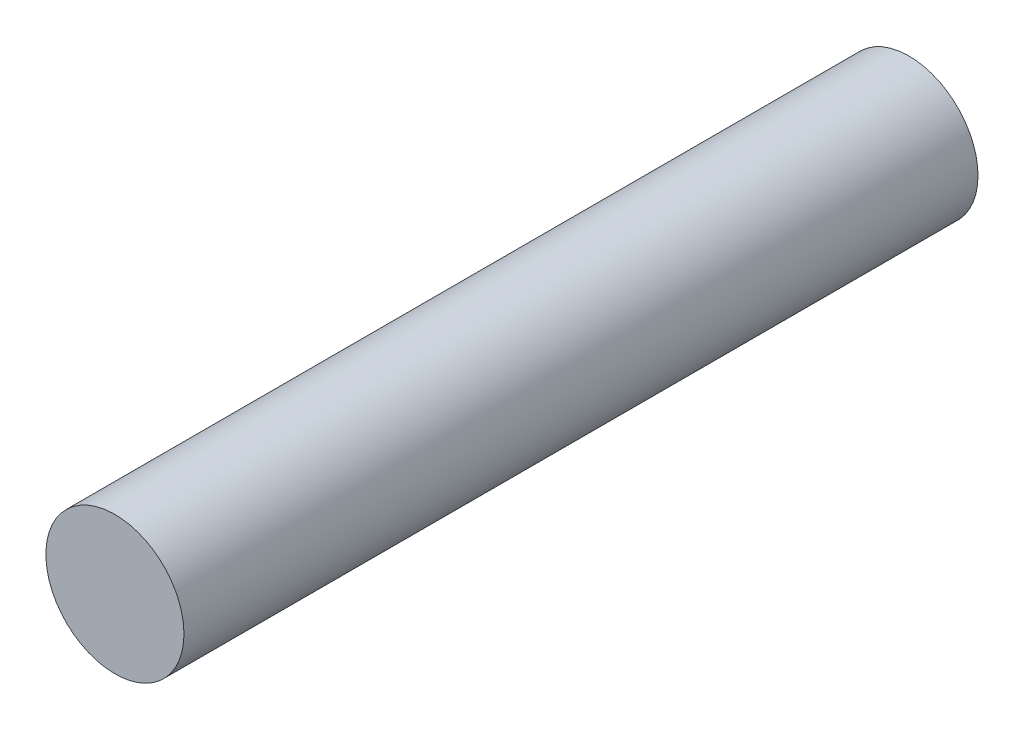
ISO-10303-21;
HEADER;
FILE_DESCRIPTION(('STEP AP214'),'2;1');
FILE_NAME('part.step','',(''),(''),'','','');
FILE_SCHEMA(('AUTOMOTIVE_DESIGN { 1 0 10303 214 1 1 1 1 }'));
ENDSEC;
DATA;
#1=APPLICATION_CONTEXT('core data for automotive mechanical design processes');
#2=APPLICATION_PROTOCOL_DEFINITION('international standard','automotive_design',2000,#1);
#3=PRODUCT_CONTEXT('',#1,'mechanical');
#4=PRODUCT('Part','Part','',(#3));
#5=PRODUCT_RELATED_PRODUCT_CATEGORY('part','',(#4));
#6=PRODUCT_DEFINITION_FORMATION('','',#4);
#7=PRODUCT_DEFINITION_CONTEXT('part definition',#1,'design');
#8=PRODUCT_DEFINITION('design','',#6,#7);
#9=PRODUCT_DEFINITION_SHAPE('','',#8);
#10=(LENGTH_UNIT() NAMED_UNIT(*) SI_UNIT(.MILLI.,.METRE.));
#11=(NAMED_UNIT(*) PLANE_ANGLE_UNIT() SI_UNIT($,.RADIAN.));
#12=(NAMED_UNIT(*) SI_UNIT($,.STERADIAN.) SOLID_ANGLE_UNIT());
#13=UNCERTAINTY_MEASURE_WITH_UNIT(LENGTH_MEASURE(1.E-05),#10,'distance_accuracy_value','');
#14=(GEOMETRIC_REPRESENTATION_CONTEXT(3) GLOBAL_UNCERTAINTY_ASSIGNED_CONTEXT((#13)) GLOBAL_UNIT_ASSIGNED_CONTEXT((#10,
#11,#12)) REPRESENTATION_CONTEXT('',''));
#15=CARTESIAN_POINT('',(0.,0.,0.));
#16=DIRECTION('',(0.,0.,1.));
#17=DIRECTION('',(1.,0.,0.));
#18=AXIS2_PLACEMENT_3D('',#15,#16,#17);
#19=CARTESIAN_POINT('',(0.,0.,10.));
#20=DIRECTION('',(0.,0.,-1.));
#21=DIRECTION('',(-1.,0.,0.));
#22=AXIS2_PLACEMENT_3D('',#19,#20,#21);
#23=CYLINDRICAL_SURFACE('',#22,2.);
#24=CARTESIAN_POINT('',(0.,0.,0.));
#25=DIRECTION('',(0.,0.,1.));
#26=DIRECTION('',(1.,0.,0.));
#27=AXIS2_PLACEMENT_3D('',#24,#25,#26);
#28=CIRCLE('',#27,2.);
#29=CARTESIAN_POINT('',(2.,0.,0.));
#30=VERTEX_POINT('',#29);
#31=EDGE_CURVE('E10',#30,#30,#28,.T.);
#32=ORIENTED_EDGE('',*,*,#31,.T.);
#33=EDGE_LOOP('',(#32));
#34=FACE_BOUND('',#33,.T.);
#35=CARTESIAN_POINT('',(0.,0.,23.));
#36=DIRECTION('',(0.,0.,1.));
#37=DIRECTION('',(1.,0.,0.));
#38=AXIS2_PLACEMENT_3D('',#35,#36,#37);
#39=CIRCLE('',#38,2.);
#40=CARTESIAN_POINT('',(2.,0.,23.));
#41=VERTEX_POINT('',#40);
#42=EDGE_CURVE('E40',#41,#41,#39,.T.);
#43=ORIENTED_EDGE('',*,*,#42,.F.);
#44=EDGE_LOOP('',(#43));
#45=FACE_BOUND('',#44,.T.);
#46=ADVANCED_FACE('F34',(#34,#45),#23,.T.);
#47=CARTESIAN_POINT('',(0.,0.,0.));
#48=DIRECTION('',(0.,0.,1.));
#49=DIRECTION('',(1.,0.,0.));
#50=AXIS2_PLACEMENT_3D('',#47,#48,#49);
#51=PLANE('',#50);
#52=ORIENTED_EDGE('',*,*,#31,.F.);
#53=EDGE_LOOP('',(#52));
#54=FACE_BOUND('',#53,.T.);
#55=ADVANCED_FACE('F49',(#54),#51,.F.);
#56=CARTESIAN_POINT('',(0.,0.,23.));
#57=DIRECTION('',(0.,0.,1.));
#58=DIRECTION('',(1.,0.,0.));
#59=AXIS2_PLACEMENT_3D('',#56,#57,#58);
#60=PLANE('',#59);
#61=ORIENTED_EDGE('',*,*,#42,.T.);
#62=EDGE_LOOP('',(#61));
#63=FACE_BOUND('',#62,.T.);
#64=ADVANCED_FACE('F46',(#63),#60,.T.);
#65=CLOSED_SHELL('',(#46,#55,#64));
#66=MANIFOLD_SOLID_BREP('B2',#65);
#67=ADVANCED_BREP_SHAPE_REPRESENTATION('',(#18,#66),#14);
#68=SHAPE_DEFINITION_REPRESENTATION(#9,#67);
ENDSEC;
END-ISO-10303-21;
